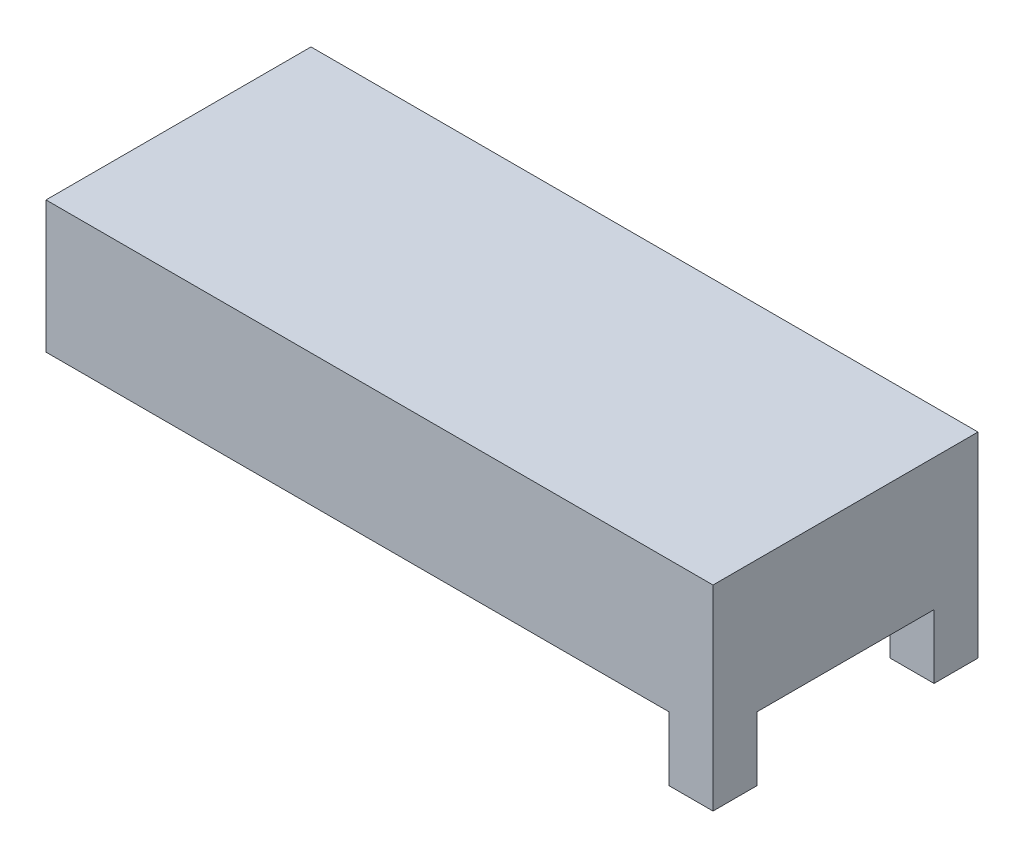
ISO-10303-21;
HEADER;
FILE_DESCRIPTION(('STEP AP214'),'2;1');
FILE_NAME('part.step','',(''),(''),'','','');
FILE_SCHEMA(('AUTOMOTIVE_DESIGN { 1 0 10303 214 1 1 1 1 }'));
ENDSEC;
DATA;
#1=APPLICATION_CONTEXT('core data for automotive mechanical design processes');
#2=APPLICATION_PROTOCOL_DEFINITION('international standard','automotive_design',2000,#1);
#3=PRODUCT_CONTEXT('',#1,'mechanical');
#4=PRODUCT('Part','Part','',(#3));
#5=PRODUCT_RELATED_PRODUCT_CATEGORY('part','',(#4));
#6=PRODUCT_DEFINITION_FORMATION('','',#4);
#7=PRODUCT_DEFINITION_CONTEXT('part definition',#1,'design');
#8=PRODUCT_DEFINITION('design','',#6,#7);
#9=PRODUCT_DEFINITION_SHAPE('','',#8);
#10=(LENGTH_UNIT() NAMED_UNIT(*) SI_UNIT(.MILLI.,.METRE.));
#11=(NAMED_UNIT(*) PLANE_ANGLE_UNIT() SI_UNIT($,.RADIAN.));
#12=(NAMED_UNIT(*) SI_UNIT($,.STERADIAN.) SOLID_ANGLE_UNIT());
#13=UNCERTAINTY_MEASURE_WITH_UNIT(LENGTH_MEASURE(1.E-05),#10,'distance_accuracy_value','');
#14=(GEOMETRIC_REPRESENTATION_CONTEXT(3) GLOBAL_UNCERTAINTY_ASSIGNED_CONTEXT((#13)) GLOBAL_UNIT_ASSIGNED_CONTEXT((#10,
#11,#12)) REPRESENTATION_CONTEXT('',''));
#15=CARTESIAN_POINT('',(0.,0.,0.));
#16=DIRECTION('',(0.,0.,1.));
#17=DIRECTION('',(1.,0.,0.));
#18=AXIS2_PLACEMENT_3D('',#15,#16,#17);
#19=CARTESIAN_POINT('',(-28.355,12.,-12.06));
#20=DIRECTION('',(0.,0.,1.));
#21=DIRECTION('',(1.,0.,0.));
#22=AXIS2_PLACEMENT_3D('',#19,#20,#21);
#23=PLANE('',#22);
#24=DIRECTION('',(-1.,0.,0.));
#25=VECTOR('',#24,1.);
#26=CARTESIAN_POINT('',(-28.355,0.,-12.06));
#27=LINE('',#26,#25);
#28=CARTESIAN_POINT('',(28.355,0.,-12.06));
#29=VERTEX_POINT('',#28);
#30=CARTESIAN_POINT('',(-28.355,0.,-12.06));
#31=VERTEX_POINT('',#30);
#32=EDGE_CURVE('E180',#29,#31,#27,.T.);
#33=ORIENTED_EDGE('',*,*,#32,.T.);
#34=DIRECTION('',(0.,-1.,0.));
#35=VECTOR('',#34,1.);
#36=CARTESIAN_POINT('',(-28.355,12.,-12.06));
#37=LINE('',#36,#35);
#38=CARTESIAN_POINT('',(-28.355,12.,-12.06));
#39=VERTEX_POINT('',#38);
#40=EDGE_CURVE('E11',#39,#31,#37,.T.);
#41=ORIENTED_EDGE('',*,*,#40,.F.);
#42=DIRECTION('',(-1.,0.,0.));
#43=VECTOR('',#42,1.);
#44=CARTESIAN_POINT('',(-28.355,12.,-12.06));
#45=LINE('',#44,#43);
#46=CARTESIAN_POINT('',(32.355,12.,-12.06));
#47=VERTEX_POINT('',#46);
#48=EDGE_CURVE('E175',#47,#39,#45,.T.);
#49=ORIENTED_EDGE('',*,*,#48,.F.);
#50=DIRECTION('',(0.,1.,0.));
#51=VECTOR('',#50,1.);
#52=CARTESIAN_POINT('',(32.355,-5.82158426658147,-12.06));
#53=LINE('',#52,#51);
#54=CARTESIAN_POINT('',(32.355,-5.82158426658147,-12.06));
#55=VERTEX_POINT('',#54);
#56=EDGE_CURVE('E134',#55,#47,#53,.T.);
#57=ORIENTED_EDGE('',*,*,#56,.F.);
#58=DIRECTION('',(-1.,0.,0.));
#59=VECTOR('',#58,1.);
#60=CARTESIAN_POINT('',(32.355,-5.82158426658147,-12.06));
#61=LINE('',#60,#59);
#62=CARTESIAN_POINT('',(28.355,-5.82158426658147,-12.06));
#63=VERTEX_POINT('',#62);
#64=EDGE_CURVE('E151',#55,#63,#61,.T.);
#65=ORIENTED_EDGE('',*,*,#64,.T.);
#66=DIRECTION('',(0.,1.,0.));
#67=VECTOR('',#66,1.);
#68=CARTESIAN_POINT('',(28.355,-5.82158426658147,-12.06));
#69=LINE('',#68,#67);
#70=EDGE_CURVE('E135',#63,#29,#69,.T.);
#71=ORIENTED_EDGE('',*,*,#70,.T.);
#72=EDGE_LOOP('',(#33,#41,#49,#57,#65,#71));
#73=FACE_BOUND('',#72,.T.);
#74=ADVANCED_FACE('F32',(#73),#23,.F.);
#75=CARTESIAN_POINT('',(-28.355,12.,12.06));
#76=DIRECTION('',(1.,0.,0.));
#77=DIRECTION('',(0.,0.,-1.));
#78=AXIS2_PLACEMENT_3D('',#75,#76,#77);
#79=PLANE('',#78);
#80=DIRECTION('',(0.,0.,1.));
#81=VECTOR('',#80,1.);
#82=CARTESIAN_POINT('',(-28.355,0.,12.06));
#83=LINE('',#82,#81);
#84=CARTESIAN_POINT('',(-28.355,0.,12.06));
#85=VERTEX_POINT('',#84);
#86=EDGE_CURVE('E182',#31,#85,#83,.T.);
#87=ORIENTED_EDGE('',*,*,#86,.T.);
#88=DIRECTION('',(0.,-1.,0.));
#89=VECTOR('',#88,1.);
#90=CARTESIAN_POINT('',(-28.355,12.,12.06));
#91=LINE('',#90,#89);
#92=CARTESIAN_POINT('',(-28.355,12.,12.06));
#93=VERTEX_POINT('',#92);
#94=EDGE_CURVE('E39',#93,#85,#91,.T.);
#95=ORIENTED_EDGE('',*,*,#94,.F.);
#96=DIRECTION('',(0.,0.,1.));
#97=VECTOR('',#96,1.);
#98=CARTESIAN_POINT('',(-28.355,12.,12.06));
#99=LINE('',#98,#97);
#100=EDGE_CURVE('E117',#39,#93,#99,.T.);
#101=ORIENTED_EDGE('',*,*,#100,.F.);
#102=ORIENTED_EDGE('',*,*,#40,.T.);
#103=EDGE_LOOP('',(#87,#95,#101,#102));
#104=FACE_BOUND('',#103,.T.);
#105=ADVANCED_FACE('F211',(#104),#79,.F.);
#106=CARTESIAN_POINT('',(-28.355,12.,12.06));
#107=DIRECTION('',(0.,0.,-1.));
#108=DIRECTION('',(-1.,0.,0.));
#109=AXIS2_PLACEMENT_3D('',#106,#107,#108);
#110=PLANE('',#109);
#111=DIRECTION('',(1.,0.,0.));
#112=VECTOR('',#111,1.);
#113=CARTESIAN_POINT('',(-28.355,0.,12.06));
#114=LINE('',#113,#112);
#115=CARTESIAN_POINT('',(28.355,0.,12.06));
#116=VERTEX_POINT('',#115);
#117=EDGE_CURVE('E177',#85,#116,#114,.T.);
#118=ORIENTED_EDGE('',*,*,#117,.T.);
#119=DIRECTION('',(0.,-1.,0.));
#120=VECTOR('',#119,1.);
#121=CARTESIAN_POINT('',(28.355,12.,12.06));
#122=LINE('',#121,#120);
#123=CARTESIAN_POINT('',(28.355,-5.82158426658147,12.06));
#124=VERTEX_POINT('',#123);
#125=EDGE_CURVE('E152',#116,#124,#122,.T.);
#126=ORIENTED_EDGE('',*,*,#125,.T.);
#127=DIRECTION('',(-1.,0.,0.));
#128=VECTOR('',#127,1.);
#129=CARTESIAN_POINT('',(32.355,-5.82158426658147,12.06));
#130=LINE('',#129,#128);
#131=CARTESIAN_POINT('',(32.355,-5.82158426658147,12.06));
#132=VERTEX_POINT('',#131);
#133=EDGE_CURVE('E126',#132,#124,#130,.T.);
#134=ORIENTED_EDGE('',*,*,#133,.F.);
#135=DIRECTION('',(0.,-1.,0.));
#136=VECTOR('',#135,1.);
#137=CARTESIAN_POINT('',(32.355,12.,12.06));
#138=LINE('',#137,#136);
#139=CARTESIAN_POINT('',(32.355,12.,12.06));
#140=VERTEX_POINT('',#139);
#141=EDGE_CURVE('E123',#140,#132,#138,.T.);
#142=ORIENTED_EDGE('',*,*,#141,.F.);
#143=DIRECTION('',(1.,0.,0.));
#144=VECTOR('',#143,1.);
#145=CARTESIAN_POINT('',(-28.355,12.,12.06));
#146=LINE('',#145,#144);
#147=EDGE_CURVE('E111',#93,#140,#146,.T.);
#148=ORIENTED_EDGE('',*,*,#147,.F.);
#149=ORIENTED_EDGE('',*,*,#94,.T.);
#150=EDGE_LOOP('',(#118,#126,#134,#142,#148,#149));
#151=FACE_BOUND('',#150,.T.);
#152=ADVANCED_FACE('F124',(#151),#110,.F.);
#153=CARTESIAN_POINT('',(0.,12.,0.));
#154=DIRECTION('',(0.,-1.,0.));
#155=DIRECTION('',(0.,0.,-1.));
#156=AXIS2_PLACEMENT_3D('',#153,#154,#155);
#157=PLANE('',#156);
#158=ORIENTED_EDGE('',*,*,#147,.T.);
#159=DIRECTION('',(0.,0.,1.));
#160=VECTOR('',#159,1.);
#161=CARTESIAN_POINT('',(32.355,12.,-12.06));
#162=LINE('',#161,#160);
#163=EDGE_CURVE('E115',#47,#140,#162,.T.);
#164=ORIENTED_EDGE('',*,*,#163,.F.);
#165=ORIENTED_EDGE('',*,*,#48,.T.);
#166=ORIENTED_EDGE('',*,*,#100,.T.);
#167=EDGE_LOOP('',(#158,#164,#165,#166));
#168=FACE_BOUND('',#167,.T.);
#169=ADVANCED_FACE('F113',(#168),#157,.F.);
#170=CARTESIAN_POINT('',(0.,0.,0.));
#171=DIRECTION('',(0.,-1.,0.));
#172=DIRECTION('',(0.,0.,-1.));
#173=AXIS2_PLACEMENT_3D('',#170,#171,#172);
#174=PLANE('',#173);
#175=DIRECTION('',(0.,0.,-1.));
#176=VECTOR('',#175,1.);
#177=CARTESIAN_POINT('',(28.355,0.,12.06));
#178=LINE('',#177,#176);
#179=CARTESIAN_POINT('',(28.355,0.,8.06));
#180=VERTEX_POINT('',#179);
#181=EDGE_CURVE('E54',#116,#180,#178,.T.);
#182=ORIENTED_EDGE('',*,*,#181,.F.);
#183=ORIENTED_EDGE('',*,*,#117,.F.);
#184=ORIENTED_EDGE('',*,*,#86,.F.);
#185=ORIENTED_EDGE('',*,*,#32,.F.);
#186=CARTESIAN_POINT('',(28.355,0.,-8.06));
#187=VERTEX_POINT('',#186);
#188=EDGE_CURVE('E46',#187,#29,#178,.T.);
#189=ORIENTED_EDGE('',*,*,#188,.F.);
#190=DIRECTION('',(-1.,0.,0.));
#191=VECTOR('',#190,1.);
#192=CARTESIAN_POINT('',(32.355,0.,-8.06));
#193=LINE('',#192,#191);
#194=CARTESIAN_POINT('',(32.355,0.,-8.06));
#195=VERTEX_POINT('',#194);
#196=EDGE_CURVE('E166',#195,#187,#193,.T.);
#197=ORIENTED_EDGE('',*,*,#196,.F.);
#198=DIRECTION('',(0.,0.,-1.));
#199=VECTOR('',#198,1.);
#200=CARTESIAN_POINT('',(32.355,0.,8.06));
#201=LINE('',#200,#199);
#202=CARTESIAN_POINT('',(32.355,0.,8.06));
#203=VERTEX_POINT('',#202);
#204=EDGE_CURVE('E144',#203,#195,#201,.T.);
#205=ORIENTED_EDGE('',*,*,#204,.F.);
#206=DIRECTION('',(-1.,0.,0.));
#207=VECTOR('',#206,1.);
#208=CARTESIAN_POINT('',(32.355,0.,8.06));
#209=LINE('',#208,#207);
#210=EDGE_CURVE('E168',#203,#180,#209,.T.);
#211=ORIENTED_EDGE('',*,*,#210,.T.);
#212=EDGE_LOOP('',(#182,#183,#184,#185,#189,#197,#205,#211));
#213=FACE_BOUND('',#212,.T.);
#214=ADVANCED_FACE('F187',(#213),#174,.T.);
#215=CARTESIAN_POINT('',(28.355,0.,0.));
#216=DIRECTION('',(1.,0.,0.));
#217=DIRECTION('',(0.,0.,-1.));
#218=AXIS2_PLACEMENT_3D('',#215,#216,#217);
#219=PLANE('',#218);
#220=ORIENTED_EDGE('',*,*,#125,.F.);
#221=ORIENTED_EDGE('',*,*,#181,.T.);
#222=DIRECTION('',(0.,1.,0.));
#223=VECTOR('',#222,1.);
#224=CARTESIAN_POINT('',(28.355,-5.82158426658147,8.06));
#225=LINE('',#224,#223);
#226=CARTESIAN_POINT('',(28.355,-5.82158426658147,8.06));
#227=VERTEX_POINT('',#226);
#228=EDGE_CURVE('E156',#227,#180,#225,.T.);
#229=ORIENTED_EDGE('',*,*,#228,.F.);
#230=DIRECTION('',(0.,0.,-1.));
#231=VECTOR('',#230,1.);
#232=CARTESIAN_POINT('',(28.355,-5.82158426658147,12.06));
#233=LINE('',#232,#231);
#234=EDGE_CURVE('E154',#124,#227,#233,.T.);
#235=ORIENTED_EDGE('',*,*,#234,.F.);
#236=EDGE_LOOP('',(#220,#221,#229,#235));
#237=FACE_BOUND('',#236,.T.);
#238=ADVANCED_FACE('F191',(#237),#219,.F.);
#239=DIRECTION('',(0.,-1.,0.));
#240=VECTOR('',#239,1.);
#241=CARTESIAN_POINT('',(28.355,0.,-8.06));
#242=LINE('',#241,#240);
#243=CARTESIAN_POINT('',(28.355,-5.82158426658147,-8.06));
#244=VERTEX_POINT('',#243);
#245=EDGE_CURVE('E158',#187,#244,#242,.T.);
#246=ORIENTED_EDGE('',*,*,#245,.F.);
#247=ORIENTED_EDGE('',*,*,#188,.T.);
#248=ORIENTED_EDGE('',*,*,#70,.F.);
#249=DIRECTION('',(0.,0.,-1.));
#250=VECTOR('',#249,1.);
#251=CARTESIAN_POINT('',(28.355,-5.82158426658147,-8.06));
#252=LINE('',#251,#250);
#253=EDGE_CURVE('E138',#244,#63,#252,.T.);
#254=ORIENTED_EDGE('',*,*,#253,.F.);
#255=EDGE_LOOP('',(#246,#247,#248,#254));
#256=FACE_BOUND('',#255,.T.);
#257=ADVANCED_FACE('F225',(#256),#219,.F.);
#258=CARTESIAN_POINT('',(32.355,-5.82158426658147,12.06));
#259=DIRECTION('',(0.,1.,0.));
#260=DIRECTION('',(0.,0.,1.));
#261=AXIS2_PLACEMENT_3D('',#258,#259,#260);
#262=PLANE('',#261);
#263=ORIENTED_EDGE('',*,*,#234,.T.);
#264=DIRECTION('',(-1.,0.,0.));
#265=VECTOR('',#264,1.);
#266=CARTESIAN_POINT('',(32.355,-5.82158426658147,8.06));
#267=LINE('',#266,#265);
#268=CARTESIAN_POINT('',(32.355,-5.82158426658147,8.06));
#269=VERTEX_POINT('',#268);
#270=EDGE_CURVE('E171',#269,#227,#267,.T.);
#271=ORIENTED_EDGE('',*,*,#270,.F.);
#272=DIRECTION('',(0.,0.,-1.));
#273=VECTOR('',#272,1.);
#274=CARTESIAN_POINT('',(32.355,-5.82158426658147,12.06));
#275=LINE('',#274,#273);
#276=EDGE_CURVE('E129',#132,#269,#275,.T.);
#277=ORIENTED_EDGE('',*,*,#276,.F.);
#278=ORIENTED_EDGE('',*,*,#133,.T.);
#279=EDGE_LOOP('',(#263,#271,#277,#278));
#280=FACE_BOUND('',#279,.T.);
#281=ADVANCED_FACE('F193',(#280),#262,.F.);
#282=CARTESIAN_POINT('',(32.355,-5.82158426658147,8.06));
#283=DIRECTION('',(0.,0.,1.));
#284=DIRECTION('',(1.,0.,0.));
#285=AXIS2_PLACEMENT_3D('',#282,#283,#284);
#286=PLANE('',#285);
#287=ORIENTED_EDGE('',*,*,#228,.T.);
#288=ORIENTED_EDGE('',*,*,#210,.F.);
#289=DIRECTION('',(0.,1.,0.));
#290=VECTOR('',#289,1.);
#291=CARTESIAN_POINT('',(32.355,-5.82158426658147,8.06));
#292=LINE('',#291,#290);
#293=EDGE_CURVE('E142',#269,#203,#292,.T.);
#294=ORIENTED_EDGE('',*,*,#293,.F.);
#295=ORIENTED_EDGE('',*,*,#270,.T.);
#296=EDGE_LOOP('',(#287,#288,#294,#295));
#297=FACE_BOUND('',#296,.T.);
#298=ADVANCED_FACE('F197',(#297),#286,.F.);
#299=CARTESIAN_POINT('',(32.355,0.,-8.06));
#300=DIRECTION('',(0.,0.,-1.));
#301=DIRECTION('',(-1.,0.,0.));
#302=AXIS2_PLACEMENT_3D('',#299,#300,#301);
#303=PLANE('',#302);
#304=ORIENTED_EDGE('',*,*,#245,.T.);
#305=DIRECTION('',(-1.,0.,0.));
#306=VECTOR('',#305,1.);
#307=CARTESIAN_POINT('',(32.355,-5.82158426658147,-8.06));
#308=LINE('',#307,#306);
#309=CARTESIAN_POINT('',(32.355,-5.82158426658147,-8.06));
#310=VERTEX_POINT('',#309);
#311=EDGE_CURVE('E163',#310,#244,#308,.T.);
#312=ORIENTED_EDGE('',*,*,#311,.F.);
#313=DIRECTION('',(0.,-1.,0.));
#314=VECTOR('',#313,1.);
#315=CARTESIAN_POINT('',(32.355,0.,-8.06));
#316=LINE('',#315,#314);
#317=EDGE_CURVE('E146',#195,#310,#316,.T.);
#318=ORIENTED_EDGE('',*,*,#317,.F.);
#319=ORIENTED_EDGE('',*,*,#196,.T.);
#320=EDGE_LOOP('',(#304,#312,#318,#319));
#321=FACE_BOUND('',#320,.T.);
#322=ADVANCED_FACE('F202',(#321),#303,.F.);
#323=CARTESIAN_POINT('',(32.355,-5.82158426658147,-8.06));
#324=DIRECTION('',(0.,1.,0.));
#325=DIRECTION('',(0.,0.,1.));
#326=AXIS2_PLACEMENT_3D('',#323,#324,#325);
#327=PLANE('',#326);
#328=ORIENTED_EDGE('',*,*,#253,.T.);
#329=ORIENTED_EDGE('',*,*,#64,.F.);
#330=DIRECTION('',(0.,0.,-1.));
#331=VECTOR('',#330,1.);
#332=CARTESIAN_POINT('',(32.355,-5.82158426658147,-8.06));
#333=LINE('',#332,#331);
#334=EDGE_CURVE('E148',#310,#55,#333,.T.);
#335=ORIENTED_EDGE('',*,*,#334,.F.);
#336=ORIENTED_EDGE('',*,*,#311,.T.);
#337=EDGE_LOOP('',(#328,#329,#335,#336));
#338=FACE_BOUND('',#337,.T.);
#339=ADVANCED_FACE('F206',(#338),#327,.F.);
#340=CARTESIAN_POINT('',(32.355,0.,0.));
#341=DIRECTION('',(1.,0.,0.));
#342=DIRECTION('',(0.,0.,-1.));
#343=AXIS2_PLACEMENT_3D('',#340,#341,#342);
#344=PLANE('',#343);
#345=ORIENTED_EDGE('',*,*,#163,.T.);
#346=ORIENTED_EDGE('',*,*,#141,.T.);
#347=ORIENTED_EDGE('',*,*,#276,.T.);
#348=ORIENTED_EDGE('',*,*,#293,.T.);
#349=ORIENTED_EDGE('',*,*,#204,.T.);
#350=ORIENTED_EDGE('',*,*,#317,.T.);
#351=ORIENTED_EDGE('',*,*,#334,.T.);
#352=ORIENTED_EDGE('',*,*,#56,.T.);
#353=EDGE_LOOP('',(#345,#346,#347,#348,#349,#350,#351,#352));
#354=FACE_BOUND('',#353,.T.);
#355=ADVANCED_FACE('F132',(#354),#344,.T.);
#356=CLOSED_SHELL('',(#74,#105,#152,#169,#214,#238,#257,#281,#298,#322,#339,#355));
#357=MANIFOLD_SOLID_BREP('B2',#356);
#358=ADVANCED_BREP_SHAPE_REPRESENTATION('',(#18,#357),#14);
#359=SHAPE_DEFINITION_REPRESENTATION(#9,#358);
ENDSEC;
END-ISO-10303-21;
